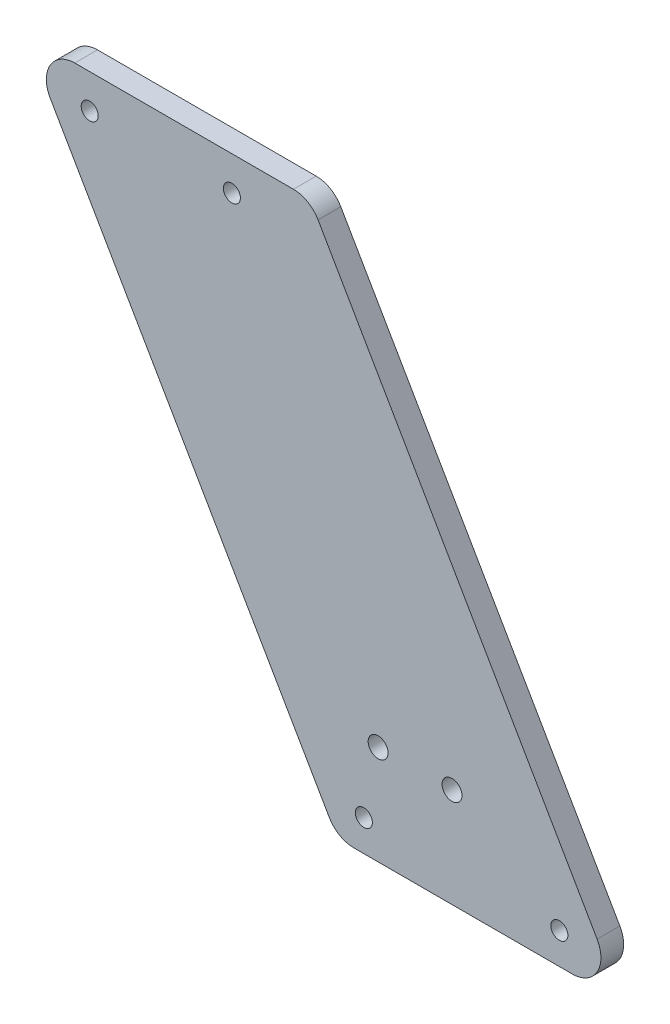
ISO-10303-21;
HEADER;
FILE_DESCRIPTION(('STEP AP214'),'2;1');
FILE_NAME('part.step','',(''),(''),'','','');
FILE_SCHEMA(('AUTOMOTIVE_DESIGN { 1 0 10303 214 1 1 1 1 }'));
ENDSEC;
DATA;
#1=APPLICATION_CONTEXT('core data for automotive mechanical design processes');
#2=APPLICATION_PROTOCOL_DEFINITION('international standard','automotive_design',2000,#1);
#3=PRODUCT_CONTEXT('',#1,'mechanical');
#4=PRODUCT('Part','Part','',(#3));
#5=PRODUCT_RELATED_PRODUCT_CATEGORY('part','',(#4));
#6=PRODUCT_DEFINITION_FORMATION('','',#4);
#7=PRODUCT_DEFINITION_CONTEXT('part definition',#1,'design');
#8=PRODUCT_DEFINITION('design','',#6,#7);
#9=PRODUCT_DEFINITION_SHAPE('','',#8);
#10=(LENGTH_UNIT() NAMED_UNIT(*) SI_UNIT(.MILLI.,.METRE.));
#11=(NAMED_UNIT(*) PLANE_ANGLE_UNIT() SI_UNIT($,.RADIAN.));
#12=(NAMED_UNIT(*) SI_UNIT($,.STERADIAN.) SOLID_ANGLE_UNIT());
#13=UNCERTAINTY_MEASURE_WITH_UNIT(LENGTH_MEASURE(1.E-05),#10,'distance_accuracy_value','');
#14=(GEOMETRIC_REPRESENTATION_CONTEXT(3) GLOBAL_UNCERTAINTY_ASSIGNED_CONTEXT((#13)) GLOBAL_UNIT_ASSIGNED_CONTEXT((#10,
#11,#12)) REPRESENTATION_CONTEXT('',''));
#15=CARTESIAN_POINT('',(0.,0.,0.));
#16=DIRECTION('',(0.,0.,1.));
#17=DIRECTION('',(1.,0.,0.));
#18=AXIS2_PLACEMENT_3D('',#15,#16,#17);
#19=CARTESIAN_POINT('',(38.4529946162075,-10.0000000000001,8.));
#20=DIRECTION('',(0.,0.,-1.));
#21=DIRECTION('',(-1.,0.,0.));
#22=AXIS2_PLACEMENT_3D('',#19,#20,#21);
#23=CYLINDRICAL_SURFACE('',#22,10.);
#24=CARTESIAN_POINT('',(38.4529946162075,-10.0000000000001,0.));
#25=DIRECTION('',(0.,0.,1.));
#26=DIRECTION('',(-1.,0.,0.));
#27=AXIS2_PLACEMENT_3D('',#24,#25,#26);
#28=CIRCLE('',#27,10.);
#29=CARTESIAN_POINT('',(47.1132486540519,-5.00000000000009,0.));
#30=VERTEX_POINT('',#29);
#31=CARTESIAN_POINT('',(38.4529946162075,0.,0.));
#32=VERTEX_POINT('',#31);
#33=EDGE_CURVE('E133',#30,#32,#28,.T.);
#34=ORIENTED_EDGE('',*,*,#33,.T.);
#35=DIRECTION('',(0.,0.,-1.));
#36=VECTOR('',#35,1.);
#37=CARTESIAN_POINT('',(38.4529946162075,0.,8.));
#38=LINE('',#37,#36);
#39=CARTESIAN_POINT('',(38.4529946162075,0.,8.));
#40=VERTEX_POINT('',#39);
#41=EDGE_CURVE('E11',#40,#32,#38,.T.);
#42=ORIENTED_EDGE('',*,*,#41,.F.);
#43=CARTESIAN_POINT('',(38.4529946162075,-10.0000000000001,8.));
#44=DIRECTION('',(0.,0.,1.));
#45=DIRECTION('',(-1.,0.,0.));
#46=AXIS2_PLACEMENT_3D('',#43,#44,#45);
#47=CIRCLE('',#46,10.);
#48=CARTESIAN_POINT('',(47.1132486540519,-5.00000000000009,8.));
#49=VERTEX_POINT('',#48);
#50=EDGE_CURVE('E148',#49,#40,#47,.T.);
#51=ORIENTED_EDGE('',*,*,#50,.F.);
#52=DIRECTION('',(0.,0.,-1.));
#53=VECTOR('',#52,1.);
#54=CARTESIAN_POINT('',(47.1132486540519,-5.00000000000009,8.));
#55=LINE('',#54,#53);
#56=EDGE_CURVE('E129',#49,#30,#55,.T.);
#57=ORIENTED_EDGE('',*,*,#56,.T.);
#58=EDGE_LOOP('',(#34,#42,#51,#57));
#59=FACE_BOUND('',#58,.T.);
#60=ADVANCED_FACE('F37',(#59),#23,.T.);
#61=CARTESIAN_POINT('',(-38.4529946162075,0.,8.));
#62=DIRECTION('',(0.,-1.,0.));
#63=DIRECTION('',(0.,0.,-1.));
#64=AXIS2_PLACEMENT_3D('',#61,#62,#63);
#65=PLANE('',#64);
#66=DIRECTION('',(-1.,0.,0.));
#67=VECTOR('',#66,1.);
#68=CARTESIAN_POINT('',(-38.4529946162075,0.,0.));
#69=LINE('',#68,#67);
#70=CARTESIAN_POINT('',(-38.4529946162075,0.,0.));
#71=VERTEX_POINT('',#70);
#72=EDGE_CURVE('E136',#32,#71,#69,.T.);
#73=ORIENTED_EDGE('',*,*,#72,.T.);
#74=DIRECTION('',(0.,0.,-1.));
#75=VECTOR('',#74,1.);
#76=CARTESIAN_POINT('',(-38.4529946162075,0.,8.));
#77=LINE('',#76,#75);
#78=CARTESIAN_POINT('',(-38.4529946162075,0.,8.));
#79=VERTEX_POINT('',#78);
#80=EDGE_CURVE('E45',#79,#71,#77,.T.);
#81=ORIENTED_EDGE('',*,*,#80,.F.);
#82=DIRECTION('',(-1.,0.,0.));
#83=VECTOR('',#82,1.);
#84=CARTESIAN_POINT('',(-38.4529946162075,0.,8.));
#85=LINE('',#84,#83);
#86=EDGE_CURVE('E96',#40,#79,#85,.T.);
#87=ORIENTED_EDGE('',*,*,#86,.F.);
#88=ORIENTED_EDGE('',*,*,#41,.T.);
#89=EDGE_LOOP('',(#73,#81,#87,#88));
#90=FACE_BOUND('',#89,.T.);
#91=ADVANCED_FACE('F256',(#90),#65,.F.);
#92=CARTESIAN_POINT('',(-38.4529946162075,-10.0000000000001,8.));
#93=DIRECTION('',(0.,0.,-1.));
#94=DIRECTION('',(-1.,0.,0.));
#95=AXIS2_PLACEMENT_3D('',#92,#93,#94);
#96=CYLINDRICAL_SURFACE('',#95,10.);
#97=CARTESIAN_POINT('',(-38.4529946162075,-10.0000000000001,0.));
#98=DIRECTION('',(0.,0.,1.));
#99=DIRECTION('',(-1.,0.,0.));
#100=AXIS2_PLACEMENT_3D('',#97,#98,#99);
#101=CIRCLE('',#100,10.);
#102=CARTESIAN_POINT('',(-47.1132486540519,-15.0000000000001,0.));
#103=VERTEX_POINT('',#102);
#104=EDGE_CURVE('E139',#71,#103,#101,.T.);
#105=ORIENTED_EDGE('',*,*,#104,.T.);
#106=DIRECTION('',(0.,0.,-1.));
#107=VECTOR('',#106,1.);
#108=CARTESIAN_POINT('',(-47.1132486540519,-15.0000000000001,8.));
#109=LINE('',#108,#107);
#110=CARTESIAN_POINT('',(-47.1132486540519,-15.0000000000001,8.));
#111=VERTEX_POINT('',#110);
#112=EDGE_CURVE('E155',#111,#103,#109,.T.);
#113=ORIENTED_EDGE('',*,*,#112,.F.);
#114=CARTESIAN_POINT('',(-38.4529946162075,-10.0000000000001,8.));
#115=DIRECTION('',(0.,0.,1.));
#116=DIRECTION('',(-1.,0.,0.));
#117=AXIS2_PLACEMENT_3D('',#114,#115,#116);
#118=CIRCLE('',#117,10.);
#119=EDGE_CURVE('E163',#79,#111,#118,.T.);
#120=ORIENTED_EDGE('',*,*,#119,.F.);
#121=ORIENTED_EDGE('',*,*,#80,.T.);
#122=EDGE_LOOP('',(#105,#113,#120,#121));
#123=FACE_BOUND('',#122,.T.);
#124=ADVANCED_FACE('F161',(#123),#96,.T.);
#125=CARTESIAN_POINT('',(-47.1132486540519,-15.,8.));
#126=DIRECTION('',(0.86602540378444,0.499999999999998,0.));
#127=DIRECTION('',(-0.499999999999998,0.86602540378444,0.));
#128=AXIS2_PLACEMENT_3D('',#125,#126,#127);
#129=PLANE('',#128);
#130=DIRECTION('',(0.499999999999998,-0.86602540378444,0.));
#131=VECTOR('',#130,1.);
#132=CARTESIAN_POINT('',(-47.1132486540519,-15.,0.));
#133=LINE('',#132,#131);
#134=CARTESIAN_POINT('',(51.0362971081838,-185.,0.));
#135=VERTEX_POINT('',#134);
#136=EDGE_CURVE('E141',#103,#135,#133,.T.);
#137=ORIENTED_EDGE('',*,*,#136,.T.);
#138=DIRECTION('',(0.,0.,-1.));
#139=VECTOR('',#138,1.);
#140=CARTESIAN_POINT('',(51.0362971081838,-185.,8.));
#141=LINE('',#140,#139);
#142=CARTESIAN_POINT('',(51.0362971081838,-185.,8.));
#143=VERTEX_POINT('',#142);
#144=EDGE_CURVE('E152',#143,#135,#141,.T.);
#145=ORIENTED_EDGE('',*,*,#144,.F.);
#146=DIRECTION('',(0.499999999999998,-0.86602540378444,0.));
#147=VECTOR('',#146,1.);
#148=CARTESIAN_POINT('',(-47.1132486540519,-15.,8.));
#149=LINE('',#148,#147);
#150=EDGE_CURVE('E175',#111,#143,#149,.T.);
#151=ORIENTED_EDGE('',*,*,#150,.F.);
#152=ORIENTED_EDGE('',*,*,#112,.T.);
#153=EDGE_LOOP('',(#137,#145,#151,#152));
#154=FACE_BOUND('',#153,.T.);
#155=ADVANCED_FACE('F171',(#154),#129,.F.);
#156=CARTESIAN_POINT('',(59.6965511460282,-180.,8.));
#157=DIRECTION('',(0.,0.,-1.));
#158=DIRECTION('',(-1.,0.,0.));
#159=AXIS2_PLACEMENT_3D('',#156,#157,#158);
#160=CYLINDRICAL_SURFACE('',#159,10.);
#161=CARTESIAN_POINT('',(59.6965511460282,-180.,0.));
#162=DIRECTION('',(0.,0.,1.));
#163=DIRECTION('',(1.,0.,0.));
#164=AXIS2_PLACEMENT_3D('',#161,#162,#163);
#165=CIRCLE('',#164,10.);
#166=CARTESIAN_POINT('',(59.6965511460282,-190.,0.));
#167=VERTEX_POINT('',#166);
#168=EDGE_CURVE('E143',#135,#167,#165,.T.);
#169=ORIENTED_EDGE('',*,*,#168,.T.);
#170=DIRECTION('',(0.,0.,-1.));
#171=VECTOR('',#170,1.);
#172=CARTESIAN_POINT('',(59.6965511460282,-190.,8.));
#173=LINE('',#172,#171);
#174=CARTESIAN_POINT('',(59.6965511460282,-190.,8.));
#175=VERTEX_POINT('',#174);
#176=EDGE_CURVE('E124',#175,#167,#173,.T.);
#177=ORIENTED_EDGE('',*,*,#176,.F.);
#178=CARTESIAN_POINT('',(59.6965511460282,-180.,8.));
#179=DIRECTION('',(0.,0.,1.));
#180=DIRECTION('',(1.,0.,0.));
#181=AXIS2_PLACEMENT_3D('',#178,#179,#180);
#182=CIRCLE('',#181,10.);
#183=EDGE_CURVE('E115',#143,#175,#182,.T.);
#184=ORIENTED_EDGE('',*,*,#183,.F.);
#185=ORIENTED_EDGE('',*,*,#144,.T.);
#186=EDGE_LOOP('',(#169,#177,#184,#185));
#187=FACE_BOUND('',#186,.T.);
#188=ADVANCED_FACE('F174',(#187),#160,.T.);
#189=CARTESIAN_POINT('',(59.6965511460282,-190.,8.));
#190=DIRECTION('',(0.,1.,0.));
#191=DIRECTION('',(-1.,0.,0.));
#192=AXIS2_PLACEMENT_3D('',#189,#190,#191);
#193=PLANE('',#192);
#194=DIRECTION('',(1.,0.,0.));
#195=VECTOR('',#194,1.);
#196=CARTESIAN_POINT('',(59.6965511460282,-190.,0.));
#197=LINE('',#196,#195);
#198=CARTESIAN_POINT('',(136.602540378443,-190.,0.));
#199=VERTEX_POINT('',#198);
#200=EDGE_CURVE('E123',#167,#199,#197,.T.);
#201=ORIENTED_EDGE('',*,*,#200,.T.);
#202=DIRECTION('',(0.,0.,-1.));
#203=VECTOR('',#202,1.);
#204=CARTESIAN_POINT('',(136.602540378443,-190.,8.));
#205=LINE('',#204,#203);
#206=CARTESIAN_POINT('',(136.602540378443,-190.,8.));
#207=VERTEX_POINT('',#206);
#208=EDGE_CURVE('E120',#207,#199,#205,.T.);
#209=ORIENTED_EDGE('',*,*,#208,.F.);
#210=DIRECTION('',(1.,0.,0.));
#211=VECTOR('',#210,1.);
#212=CARTESIAN_POINT('',(59.6965511460282,-190.,8.));
#213=LINE('',#212,#211);
#214=EDGE_CURVE('E109',#175,#207,#213,.T.);
#215=ORIENTED_EDGE('',*,*,#214,.F.);
#216=ORIENTED_EDGE('',*,*,#176,.T.);
#217=EDGE_LOOP('',(#201,#209,#215,#216));
#218=FACE_BOUND('',#217,.T.);
#219=ADVANCED_FACE('F121',(#218),#193,.F.);
#220=CARTESIAN_POINT('',(136.602540378443,-180.,8.));
#221=DIRECTION('',(0.,0.,-1.));
#222=DIRECTION('',(-1.,0.,0.));
#223=AXIS2_PLACEMENT_3D('',#220,#221,#222);
#224=CYLINDRICAL_SURFACE('',#223,10.);
#225=CARTESIAN_POINT('',(136.602540378443,-180.,0.));
#226=DIRECTION('',(0.,0.,1.));
#227=DIRECTION('',(-1.,0.,0.));
#228=AXIS2_PLACEMENT_3D('',#225,#226,#227);
#229=CIRCLE('',#228,10.);
#230=CARTESIAN_POINT('',(145.262794416288,-175.,0.));
#231=VERTEX_POINT('',#230);
#232=EDGE_CURVE('E82',#199,#231,#229,.T.);
#233=ORIENTED_EDGE('',*,*,#232,.T.);
#234=DIRECTION('',(0.,0.,-1.));
#235=VECTOR('',#234,1.);
#236=CARTESIAN_POINT('',(145.262794416288,-175.,8.));
#237=LINE('',#236,#235);
#238=CARTESIAN_POINT('',(145.262794416288,-175.,8.));
#239=VERTEX_POINT('',#238);
#240=EDGE_CURVE('E125',#239,#231,#237,.T.);
#241=ORIENTED_EDGE('',*,*,#240,.F.);
#242=CARTESIAN_POINT('',(136.602540378443,-180.,8.));
#243=DIRECTION('',(0.,0.,1.));
#244=DIRECTION('',(-1.,0.,0.));
#245=AXIS2_PLACEMENT_3D('',#242,#243,#244);
#246=CIRCLE('',#245,10.);
#247=EDGE_CURVE('E113',#207,#239,#246,.T.);
#248=ORIENTED_EDGE('',*,*,#247,.F.);
#249=ORIENTED_EDGE('',*,*,#208,.T.);
#250=EDGE_LOOP('',(#233,#241,#248,#249));
#251=FACE_BOUND('',#250,.T.);
#252=ADVANCED_FACE('F127',(#251),#224,.T.);
#253=CARTESIAN_POINT('',(47.1132486540519,-5.00000000000009,8.));
#254=DIRECTION('',(-0.86602540378444,-0.499999999999998,0.));
#255=DIRECTION('',(0.499999999999998,-0.86602540378444,0.));
#256=AXIS2_PLACEMENT_3D('',#253,#254,#255);
#257=PLANE('',#256);
#258=DIRECTION('',(-0.499999999999998,0.86602540378444,0.));
#259=VECTOR('',#258,1.);
#260=CARTESIAN_POINT('',(47.1132486540519,-5.00000000000009,0.));
#261=LINE('',#260,#259);
#262=EDGE_CURVE('E88',#231,#30,#261,.T.);
#263=ORIENTED_EDGE('',*,*,#262,.T.);
#264=ORIENTED_EDGE('',*,*,#56,.F.);
#265=DIRECTION('',(-0.499999999999998,0.86602540378444,0.));
#266=VECTOR('',#265,1.);
#267=CARTESIAN_POINT('',(47.1132486540519,-5.00000000000009,8.));
#268=LINE('',#267,#266);
#269=EDGE_CURVE('E53',#239,#49,#268,.T.);
#270=ORIENTED_EDGE('',*,*,#269,.F.);
#271=ORIENTED_EDGE('',*,*,#240,.T.);
#272=EDGE_LOOP('',(#263,#264,#270,#271));
#273=FACE_BOUND('',#272,.T.);
#274=ADVANCED_FACE('F228',(#273),#257,.F.);
#275=CARTESIAN_POINT('',(38.4529946162075,-10.0000000000001,8.));
#276=DIRECTION('',(0.,0.,-1.));
#277=DIRECTION('',(-1.,0.,0.));
#278=AXIS2_PLACEMENT_3D('',#275,#276,#277);
#279=PLANE('',#278);
#280=CARTESIAN_POINT('',(-33.1952978494814,-12.,8.00000000000001));
#281=DIRECTION('',(0.,0.,1.));
#282=DIRECTION('',(1.,0.,0.));
#283=AXIS2_PLACEMENT_3D('',#280,#281,#282);
#284=CIRCLE('',#283,2.99999999999993);
#285=CARTESIAN_POINT('',(-30.1952978494814,-12.,8.00000000000001));
#286=VERTEX_POINT('',#285);
#287=EDGE_CURVE('E206',#286,#286,#284,.T.);
#288=ORIENTED_EDGE('',*,*,#287,.F.);
#289=EDGE_LOOP('',(#288));
#290=FACE_BOUND('',#289,.T.);
#291=CARTESIAN_POINT('',(63.2221971051861,-179.,8.00000000000001));
#292=DIRECTION('',(0.,0.,1.));
#293=DIRECTION('',(1.,0.,0.));
#294=AXIS2_PLACEMENT_3D('',#291,#292,#293);
#295=CIRCLE('',#294,3.00000000000001);
#296=CARTESIAN_POINT('',(66.2221971051862,-179.,8.00000000000001));
#297=VERTEX_POINT('',#296);
#298=EDGE_CURVE('E185',#297,#297,#295,.T.);
#299=ORIENTED_EDGE('',*,*,#298,.F.);
#300=EDGE_LOOP('',(#299));
#301=FACE_BOUND('',#300,.T.);
#302=CARTESIAN_POINT('',(131.983738224926,-179.,8.00000000000001));
#303=DIRECTION('',(0.,0.,1.));
#304=DIRECTION('',(1.,0.,0.));
#305=AXIS2_PLACEMENT_3D('',#302,#303,#304);
#306=CIRCLE('',#305,2.99999999999999);
#307=CARTESIAN_POINT('',(134.983738224926,-179.,8.00000000000001));
#308=VERTEX_POINT('',#307);
#309=EDGE_CURVE('E184',#308,#308,#306,.T.);
#310=ORIENTED_EDGE('',*,*,#309,.F.);
#311=EDGE_LOOP('',(#310));
#312=FACE_BOUND('',#311,.T.);
#313=CARTESIAN_POINT('',(94.2326489408037,-155.067474764402,8.00000000000001));
#314=DIRECTION('',(0.,0.,1.));
#315=DIRECTION('',(1.,0.,0.));
#316=AXIS2_PLACEMENT_3D('',#313,#314,#315);
#317=CIRCLE('',#316,3.50000000000001);
#318=CARTESIAN_POINT('',(97.7326489408037,-155.067474764402,8.00000000000001));
#319=VERTEX_POINT('',#318);
#320=EDGE_CURVE('E191',#319,#319,#317,.T.);
#321=ORIENTED_EDGE('',*,*,#320,.F.);
#322=EDGE_LOOP('',(#321));
#323=FACE_BOUND('',#322,.T.);
#324=CARTESIAN_POINT('',(68.2326489408037,-155.067474764402,8.00000000000001));
#325=DIRECTION('',(0.,0.,1.));
#326=DIRECTION('',(1.,0.,0.));
#327=AXIS2_PLACEMENT_3D('',#324,#325,#326);
#328=CIRCLE('',#327,3.49999999999999);
#329=CARTESIAN_POINT('',(71.7326489408037,-155.067474764402,8.00000000000001));
#330=VERTEX_POINT('',#329);
#331=EDGE_CURVE('E197',#330,#330,#328,.T.);
#332=ORIENTED_EDGE('',*,*,#331,.F.);
#333=EDGE_LOOP('',(#332));
#334=FACE_BOUND('',#333,.T.);
#335=CARTESIAN_POINT('',(16.8047021505186,-11.9999999999999,8.00000000000001));
#336=DIRECTION('',(0.,0.,1.));
#337=DIRECTION('',(1.,0.,0.));
#338=AXIS2_PLACEMENT_3D('',#335,#336,#337);
#339=CIRCLE('',#338,2.9999999999999);
#340=CARTESIAN_POINT('',(19.8047021505185,-11.9999999999999,8.00000000000001));
#341=VERTEX_POINT('',#340);
#342=EDGE_CURVE('E203',#341,#341,#339,.T.);
#343=ORIENTED_EDGE('',*,*,#342,.F.);
#344=EDGE_LOOP('',(#343));
#345=FACE_BOUND('',#344,.T.);
#346=ORIENTED_EDGE('',*,*,#50,.T.);
#347=ORIENTED_EDGE('',*,*,#86,.T.);
#348=ORIENTED_EDGE('',*,*,#119,.T.);
#349=ORIENTED_EDGE('',*,*,#150,.T.);
#350=ORIENTED_EDGE('',*,*,#183,.T.);
#351=ORIENTED_EDGE('',*,*,#214,.T.);
#352=ORIENTED_EDGE('',*,*,#247,.T.);
#353=ORIENTED_EDGE('',*,*,#269,.T.);
#354=EDGE_LOOP('',(#346,#347,#348,#349,#350,#351,#352,#353));
#355=FACE_BOUND('',#354,.T.);
#356=ADVANCED_FACE('F111',(#290,#301,#312,#323,#334,#345,#355),#279,.F.);
#357=CARTESIAN_POINT('',(38.4529946162075,-10.0000000000001,0.));
#358=DIRECTION('',(0.,0.,-1.));
#359=DIRECTION('',(-1.,0.,0.));
#360=AXIS2_PLACEMENT_3D('',#357,#358,#359);
#361=PLANE('',#360);
#362=CARTESIAN_POINT('',(-33.1952978494814,-12.,0.));
#363=DIRECTION('',(0.,0.,1.));
#364=DIRECTION('',(1.,0.,0.));
#365=AXIS2_PLACEMENT_3D('',#362,#363,#364);
#366=CIRCLE('',#365,2.99999999999993);
#367=CARTESIAN_POINT('',(-30.1952978494814,-12.,0.));
#368=VERTEX_POINT('',#367);
#369=EDGE_CURVE('E137',#368,#368,#366,.T.);
#370=ORIENTED_EDGE('',*,*,#369,.T.);
#371=EDGE_LOOP('',(#370));
#372=FACE_BOUND('',#371,.T.);
#373=CARTESIAN_POINT('',(63.2221971051861,-179.,0.));
#374=DIRECTION('',(0.,0.,1.));
#375=DIRECTION('',(1.,0.,0.));
#376=AXIS2_PLACEMENT_3D('',#373,#374,#375);
#377=CIRCLE('',#376,3.00000000000001);
#378=CARTESIAN_POINT('',(66.2221971051862,-179.,0.));
#379=VERTEX_POINT('',#378);
#380=EDGE_CURVE('E207',#379,#379,#377,.T.);
#381=ORIENTED_EDGE('',*,*,#380,.T.);
#382=EDGE_LOOP('',(#381));
#383=FACE_BOUND('',#382,.T.);
#384=CARTESIAN_POINT('',(131.983738224926,-179.,0.));
#385=DIRECTION('',(0.,0.,1.));
#386=DIRECTION('',(1.,0.,0.));
#387=AXIS2_PLACEMENT_3D('',#384,#385,#386);
#388=CIRCLE('',#387,2.99999999999999);
#389=CARTESIAN_POINT('',(134.983738224926,-179.,0.));
#390=VERTEX_POINT('',#389);
#391=EDGE_CURVE('E181',#390,#390,#388,.T.);
#392=ORIENTED_EDGE('',*,*,#391,.T.);
#393=EDGE_LOOP('',(#392));
#394=FACE_BOUND('',#393,.T.);
#395=CARTESIAN_POINT('',(94.2326489408037,-155.067474764402,0.));
#396=DIRECTION('',(0.,0.,1.));
#397=DIRECTION('',(1.,0.,0.));
#398=AXIS2_PLACEMENT_3D('',#395,#396,#397);
#399=CIRCLE('',#398,3.50000000000001);
#400=CARTESIAN_POINT('',(97.7326489408037,-155.067474764402,0.));
#401=VERTEX_POINT('',#400);
#402=EDGE_CURVE('E188',#401,#401,#399,.T.);
#403=ORIENTED_EDGE('',*,*,#402,.T.);
#404=EDGE_LOOP('',(#403));
#405=FACE_BOUND('',#404,.T.);
#406=CARTESIAN_POINT('',(68.2326489408037,-155.067474764402,0.));
#407=DIRECTION('',(0.,0.,1.));
#408=DIRECTION('',(1.,0.,0.));
#409=AXIS2_PLACEMENT_3D('',#406,#407,#408);
#410=CIRCLE('',#409,3.49999999999999);
#411=CARTESIAN_POINT('',(71.7326489408037,-155.067474764402,0.));
#412=VERTEX_POINT('',#411);
#413=EDGE_CURVE('E194',#412,#412,#410,.T.);
#414=ORIENTED_EDGE('',*,*,#413,.T.);
#415=EDGE_LOOP('',(#414));
#416=FACE_BOUND('',#415,.T.);
#417=CARTESIAN_POINT('',(16.8047021505186,-11.9999999999999,0.));
#418=DIRECTION('',(0.,0.,1.));
#419=DIRECTION('',(1.,0.,0.));
#420=AXIS2_PLACEMENT_3D('',#417,#418,#419);
#421=CIRCLE('',#420,2.9999999999999);
#422=CARTESIAN_POINT('',(19.8047021505185,-11.9999999999999,0.));
#423=VERTEX_POINT('',#422);
#424=EDGE_CURVE('E200',#423,#423,#421,.T.);
#425=ORIENTED_EDGE('',*,*,#424,.T.);
#426=EDGE_LOOP('',(#425));
#427=FACE_BOUND('',#426,.T.);
#428=ORIENTED_EDGE('',*,*,#33,.F.);
#429=ORIENTED_EDGE('',*,*,#262,.F.);
#430=ORIENTED_EDGE('',*,*,#232,.F.);
#431=ORIENTED_EDGE('',*,*,#200,.F.);
#432=ORIENTED_EDGE('',*,*,#168,.F.);
#433=ORIENTED_EDGE('',*,*,#136,.F.);
#434=ORIENTED_EDGE('',*,*,#104,.F.);
#435=ORIENTED_EDGE('',*,*,#72,.F.);
#436=EDGE_LOOP('',(#428,#429,#430,#431,#432,#433,#434,#435));
#437=FACE_BOUND('',#436,.T.);
#438=ADVANCED_FACE('F167',(#372,#383,#394,#405,#416,#427,#437),#361,.T.);
#439=CARTESIAN_POINT('',(16.8047021505186,-11.9999999999999,0.));
#440=DIRECTION('',(0.,0.,1.));
#441=DIRECTION('',(1.,0.,0.));
#442=AXIS2_PLACEMENT_3D('',#439,#440,#441);
#443=CYLINDRICAL_SURFACE('',#442,2.9999999999999);
#444=ORIENTED_EDGE('',*,*,#424,.F.);
#445=EDGE_LOOP('',(#444));
#446=FACE_BOUND('',#445,.T.);
#447=ORIENTED_EDGE('',*,*,#342,.T.);
#448=EDGE_LOOP('',(#447));
#449=FACE_BOUND('',#448,.T.);
#450=ADVANCED_FACE('F240',(#446,#449),#443,.F.);
#451=CARTESIAN_POINT('',(68.2326489408037,-155.067474764402,0.));
#452=DIRECTION('',(0.,0.,1.));
#453=DIRECTION('',(1.,0.,0.));
#454=AXIS2_PLACEMENT_3D('',#451,#452,#453);
#455=CYLINDRICAL_SURFACE('',#454,3.49999999999999);
#456=ORIENTED_EDGE('',*,*,#413,.F.);
#457=EDGE_LOOP('',(#456));
#458=FACE_BOUND('',#457,.T.);
#459=ORIENTED_EDGE('',*,*,#331,.T.);
#460=EDGE_LOOP('',(#459));
#461=FACE_BOUND('',#460,.T.);
#462=ADVANCED_FACE('F242',(#458,#461),#455,.F.);
#463=CARTESIAN_POINT('',(94.2326489408037,-155.067474764402,0.));
#464=DIRECTION('',(0.,0.,1.));
#465=DIRECTION('',(1.,0.,0.));
#466=AXIS2_PLACEMENT_3D('',#463,#464,#465);
#467=CYLINDRICAL_SURFACE('',#466,3.50000000000001);
#468=ORIENTED_EDGE('',*,*,#402,.F.);
#469=EDGE_LOOP('',(#468));
#470=FACE_BOUND('',#469,.T.);
#471=ORIENTED_EDGE('',*,*,#320,.T.);
#472=EDGE_LOOP('',(#471));
#473=FACE_BOUND('',#472,.T.);
#474=ADVANCED_FACE('F249',(#470,#473),#467,.F.);
#475=CARTESIAN_POINT('',(131.983738224926,-179.,0.));
#476=DIRECTION('',(0.,0.,1.));
#477=DIRECTION('',(1.,0.,0.));
#478=AXIS2_PLACEMENT_3D('',#475,#476,#477);
#479=CYLINDRICAL_SURFACE('',#478,2.99999999999999);
#480=ORIENTED_EDGE('',*,*,#391,.F.);
#481=EDGE_LOOP('',(#480));
#482=FACE_BOUND('',#481,.T.);
#483=ORIENTED_EDGE('',*,*,#309,.T.);
#484=EDGE_LOOP('',(#483));
#485=FACE_BOUND('',#484,.T.);
#486=ADVANCED_FACE('F338',(#482,#485),#479,.F.);
#487=CARTESIAN_POINT('',(63.2221971051861,-179.,0.));
#488=DIRECTION('',(0.,0.,1.));
#489=DIRECTION('',(1.,0.,0.));
#490=AXIS2_PLACEMENT_3D('',#487,#488,#489);
#491=CYLINDRICAL_SURFACE('',#490,3.00000000000001);
#492=ORIENTED_EDGE('',*,*,#380,.F.);
#493=EDGE_LOOP('',(#492));
#494=FACE_BOUND('',#493,.T.);
#495=ORIENTED_EDGE('',*,*,#298,.T.);
#496=EDGE_LOOP('',(#495));
#497=FACE_BOUND('',#496,.T.);
#498=ADVANCED_FACE('F222',(#494,#497),#491,.F.);
#499=CARTESIAN_POINT('',(-33.1952978494814,-12.,0.));
#500=DIRECTION('',(0.,0.,1.));
#501=DIRECTION('',(1.,0.,0.));
#502=AXIS2_PLACEMENT_3D('',#499,#500,#501);
#503=CYLINDRICAL_SURFACE('',#502,2.99999999999993);
#504=ORIENTED_EDGE('',*,*,#369,.F.);
#505=EDGE_LOOP('',(#504));
#506=FACE_BOUND('',#505,.T.);
#507=ORIENTED_EDGE('',*,*,#287,.T.);
#508=EDGE_LOOP('',(#507));
#509=FACE_BOUND('',#508,.T.);
#510=ADVANCED_FACE('F219',(#506,#509),#503,.F.);
#511=CLOSED_SHELL('',(#60,#91,#124,#155,#188,#219,#252,#274,#356,#438,#450,#462,#474,#486,#498,#510));
#512=MANIFOLD_SOLID_BREP('B2',#511);
#513=ADVANCED_BREP_SHAPE_REPRESENTATION('',(#18,#512),#14);
#514=SHAPE_DEFINITION_REPRESENTATION(#9,#513);
ENDSEC;
END-ISO-10303-21;
